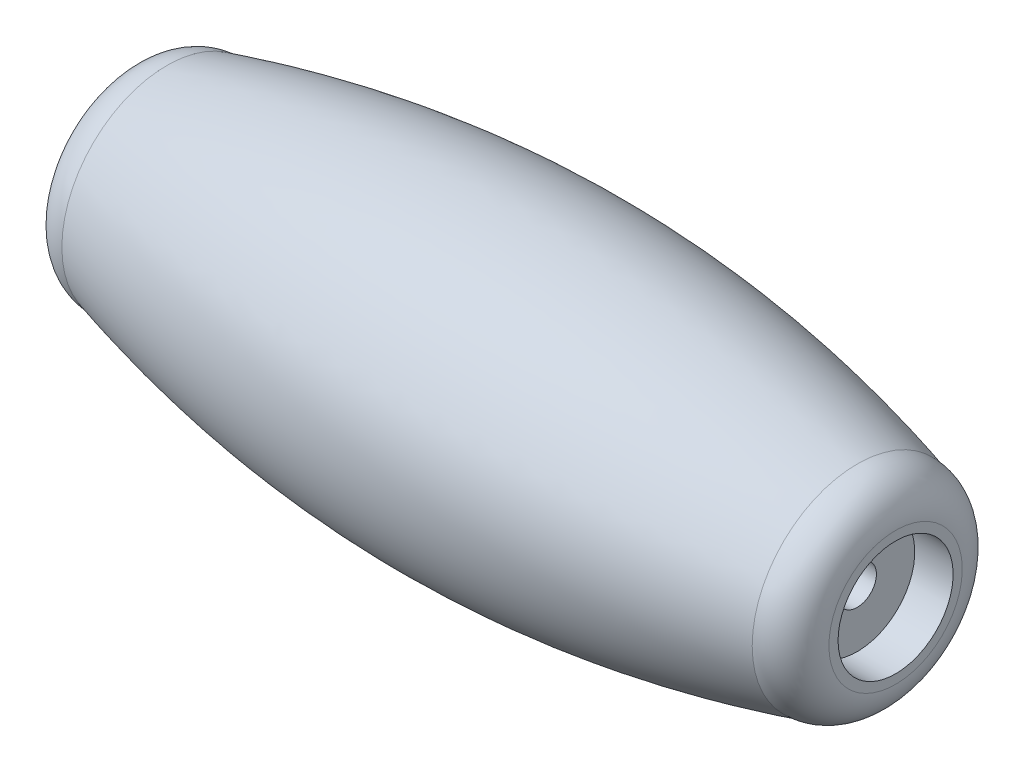
ISO-10303-21;
HEADER;
FILE_DESCRIPTION(('STEP AP214'),'2;1');
FILE_NAME('part.step','',(''),(''),'','','');
FILE_SCHEMA(('AUTOMOTIVE_DESIGN { 1 0 10303 214 1 1 1 1 }'));
ENDSEC;
DATA;
#1=APPLICATION_CONTEXT('core data for automotive mechanical design processes');
#2=APPLICATION_PROTOCOL_DEFINITION('international standard','automotive_design',2000,#1);
#3=PRODUCT_CONTEXT('',#1,'mechanical');
#4=PRODUCT('Part','Part','',(#3));
#5=PRODUCT_RELATED_PRODUCT_CATEGORY('part','',(#4));
#6=PRODUCT_DEFINITION_FORMATION('','',#4);
#7=PRODUCT_DEFINITION_CONTEXT('part definition',#1,'design');
#8=PRODUCT_DEFINITION('design','',#6,#7);
#9=PRODUCT_DEFINITION_SHAPE('','',#8);
#10=(LENGTH_UNIT() NAMED_UNIT(*) SI_UNIT(.MILLI.,.METRE.));
#11=(NAMED_UNIT(*) PLANE_ANGLE_UNIT() SI_UNIT($,.RADIAN.));
#12=(NAMED_UNIT(*) SI_UNIT($,.STERADIAN.) SOLID_ANGLE_UNIT());
#13=UNCERTAINTY_MEASURE_WITH_UNIT(LENGTH_MEASURE(1.E-05),#10,'distance_accuracy_value','');
#14=(GEOMETRIC_REPRESENTATION_CONTEXT(3) GLOBAL_UNCERTAINTY_ASSIGNED_CONTEXT((#13)) GLOBAL_UNIT_ASSIGNED_CONTEXT((#10,
#11,#12)) REPRESENTATION_CONTEXT('',''));
#15=CARTESIAN_POINT('',(0.,0.,0.));
#16=DIRECTION('',(0.,0.,1.));
#17=DIRECTION('',(1.,0.,0.));
#18=AXIS2_PLACEMENT_3D('',#15,#16,#17);
#19=CARTESIAN_POINT('',(15.,2.25,0.));
#20=DIRECTION('',(-1.,0.,0.));
#21=DIRECTION('',(0.,0.,1.));
#22=AXIS2_PLACEMENT_3D('',#19,#20,#21);
#23=PLANE('',#22);
#24=CARTESIAN_POINT('',(15.,0.,0.));
#25=DIRECTION('',(-1.,0.,0.));
#26=DIRECTION('',(0.,0.,1.));
#27=AXIS2_PLACEMENT_3D('',#24,#25,#26);
#28=CIRCLE('',#27,2.6083193093986);
#29=CARTESIAN_POINT('',(15.,0.,2.6083193093986));
#30=VERTEX_POINT('',#29);
#31=EDGE_CURVE('E68',#30,#30,#28,.T.);
#32=ORIENTED_EDGE('',*,*,#31,.F.);
#33=EDGE_LOOP('',(#32));
#34=FACE_BOUND('',#33,.T.);
#35=CARTESIAN_POINT('',(15.,0.,0.));
#36=DIRECTION('',(-1.,0.,0.));
#37=DIRECTION('',(0.,0.,1.));
#38=AXIS2_PLACEMENT_3D('',#35,#36,#37);
#39=CIRCLE('',#38,2.25);
#40=CARTESIAN_POINT('',(15.,0.,2.25));
#41=VERTEX_POINT('',#40);
#42=EDGE_CURVE('E10',#41,#41,#39,.T.);
#43=ORIENTED_EDGE('',*,*,#42,.T.);
#44=EDGE_LOOP('',(#43));
#45=FACE_BOUND('',#44,.T.);
#46=ADVANCED_FACE('F34',(#34,#45),#23,.F.);
#47=CARTESIAN_POINT('',(-15.,0.,0.));
#48=DIRECTION('',(-1.,0.,0.));
#49=DIRECTION('',(0.,0.,1.));
#50=AXIS2_PLACEMENT_3D('',#47,#48,#49);
#51=CYLINDRICAL_SURFACE('',#50,2.25);
#52=ORIENTED_EDGE('',*,*,#42,.F.);
#53=EDGE_LOOP('',(#52));
#54=FACE_BOUND('',#53,.T.);
#55=CARTESIAN_POINT('',(13.5,0.,0.));
#56=DIRECTION('',(-1.,0.,0.));
#57=DIRECTION('',(0.,0.,1.));
#58=AXIS2_PLACEMENT_3D('',#55,#56,#57);
#59=CIRCLE('',#58,2.25);
#60=CARTESIAN_POINT('',(13.5,0.,2.25));
#61=VERTEX_POINT('',#60);
#62=EDGE_CURVE('E40',#61,#61,#59,.T.);
#63=ORIENTED_EDGE('',*,*,#62,.T.);
#64=EDGE_LOOP('',(#63));
#65=FACE_BOUND('',#64,.T.);
#66=ADVANCED_FACE('F106',(#54,#65),#51,.F.);
#67=CARTESIAN_POINT('',(13.5,2.25,0.));
#68=DIRECTION('',(-1.,0.,0.));
#69=DIRECTION('',(0.,0.,1.));
#70=AXIS2_PLACEMENT_3D('',#67,#68,#69);
#71=PLANE('',#70);
#72=ORIENTED_EDGE('',*,*,#62,.F.);
#73=EDGE_LOOP('',(#72));
#74=FACE_BOUND('',#73,.T.);
#75=CARTESIAN_POINT('',(13.5,0.,0.));
#76=DIRECTION('',(-1.,0.,0.));
#77=DIRECTION('',(0.,0.,1.));
#78=AXIS2_PLACEMENT_3D('',#75,#76,#77);
#79=CIRCLE('',#78,0.75);
#80=CARTESIAN_POINT('',(13.5,0.,0.75));
#81=VERTEX_POINT('',#80);
#82=EDGE_CURVE('E44',#81,#81,#79,.T.);
#83=ORIENTED_EDGE('',*,*,#82,.T.);
#84=EDGE_LOOP('',(#83));
#85=FACE_BOUND('',#84,.T.);
#86=ADVANCED_FACE('F103',(#74,#85),#71,.F.);
#87=CARTESIAN_POINT('',(-15.,0.,0.));
#88=DIRECTION('',(-1.,0.,0.));
#89=DIRECTION('',(0.,0.,1.));
#90=AXIS2_PLACEMENT_3D('',#87,#88,#89);
#91=CYLINDRICAL_SURFACE('',#90,0.75);
#92=ORIENTED_EDGE('',*,*,#82,.F.);
#93=EDGE_LOOP('',(#92));
#94=FACE_BOUND('',#93,.T.);
#95=CARTESIAN_POINT('',(-13.5,0.,0.));
#96=DIRECTION('',(-1.,0.,0.));
#97=DIRECTION('',(0.,0.,1.));
#98=AXIS2_PLACEMENT_3D('',#95,#96,#97);
#99=CIRCLE('',#98,0.75);
#100=CARTESIAN_POINT('',(-13.5,0.,0.75));
#101=VERTEX_POINT('',#100);
#102=EDGE_CURVE('E48',#101,#101,#99,.T.);
#103=ORIENTED_EDGE('',*,*,#102,.T.);
#104=EDGE_LOOP('',(#103));
#105=FACE_BOUND('',#104,.T.);
#106=ADVANCED_FACE('F99',(#94,#105),#91,.F.);
#107=CARTESIAN_POINT('',(-13.5,2.25,0.));
#108=DIRECTION('',(1.,0.,0.));
#109=DIRECTION('',(0.,0.,-1.));
#110=AXIS2_PLACEMENT_3D('',#107,#108,#109);
#111=PLANE('',#110);
#112=ORIENTED_EDGE('',*,*,#102,.F.);
#113=EDGE_LOOP('',(#112));
#114=FACE_BOUND('',#113,.T.);
#115=CARTESIAN_POINT('',(-13.5,0.,0.));
#116=DIRECTION('',(-1.,0.,0.));
#117=DIRECTION('',(0.,0.,1.));
#118=AXIS2_PLACEMENT_3D('',#115,#116,#117);
#119=CIRCLE('',#118,2.25);
#120=CARTESIAN_POINT('',(-13.5,0.,2.25));
#121=VERTEX_POINT('',#120);
#122=EDGE_CURVE('E53',#121,#121,#119,.T.);
#123=ORIENTED_EDGE('',*,*,#122,.T.);
#124=EDGE_LOOP('',(#123));
#125=FACE_BOUND('',#124,.T.);
#126=ADVANCED_FACE('F95',(#114,#125),#111,.F.);
#127=CARTESIAN_POINT('',(-15.,0.,0.));
#128=DIRECTION('',(-1.,0.,0.));
#129=DIRECTION('',(0.,0.,1.));
#130=AXIS2_PLACEMENT_3D('',#127,#128,#129);
#131=CYLINDRICAL_SURFACE('',#130,2.25);
#132=ORIENTED_EDGE('',*,*,#122,.F.);
#133=EDGE_LOOP('',(#132));
#134=FACE_BOUND('',#133,.T.);
#135=CARTESIAN_POINT('',(-15.,0.,0.));
#136=DIRECTION('',(-1.,0.,0.));
#137=DIRECTION('',(0.,0.,1.));
#138=AXIS2_PLACEMENT_3D('',#135,#136,#137);
#139=CIRCLE('',#138,2.25);
#140=CARTESIAN_POINT('',(-15.,0.,2.25));
#141=VERTEX_POINT('',#140);
#142=EDGE_CURVE('E56',#141,#141,#139,.T.);
#143=ORIENTED_EDGE('',*,*,#142,.T.);
#144=EDGE_LOOP('',(#143));
#145=FACE_BOUND('',#144,.T.);
#146=ADVANCED_FACE('F91',(#134,#145),#131,.F.);
#147=CARTESIAN_POINT('',(-15.,2.25,0.));
#148=DIRECTION('',(1.,0.,0.));
#149=DIRECTION('',(0.,0.,-1.));
#150=AXIS2_PLACEMENT_3D('',#147,#148,#149);
#151=PLANE('',#150);
#152=ORIENTED_EDGE('',*,*,#142,.F.);
#153=EDGE_LOOP('',(#152));
#154=FACE_BOUND('',#153,.T.);
#155=CARTESIAN_POINT('',(-15.,0.,0.));
#156=DIRECTION('',(-1.,0.,0.));
#157=DIRECTION('',(0.,0.,1.));
#158=AXIS2_PLACEMENT_3D('',#155,#156,#157);
#159=CIRCLE('',#158,2.6083193093986);
#160=CARTESIAN_POINT('',(-15.,0.,2.6083193093986));
#161=VERTEX_POINT('',#160);
#162=EDGE_CURVE('E59',#161,#161,#159,.T.);
#163=ORIENTED_EDGE('',*,*,#162,.T.);
#164=EDGE_LOOP('',(#163));
#165=FACE_BOUND('',#164,.T.);
#166=ADVANCED_FACE('F87',(#154,#165),#151,.F.);
#167=CARTESIAN_POINT('',(-13.5,0.,0.));
#168=DIRECTION('',(-1.,0.,0.));
#169=DIRECTION('',(0.,0.,1.));
#170=AXIS2_PLACEMENT_3D('',#167,#168,#169);
#171=TOROIDAL_SURFACE('',#170,2.6083193093986,1.5);
#172=ORIENTED_EDGE('',*,*,#162,.F.);
#173=EDGE_LOOP('',(#172));
#174=FACE_BOUND('',#173,.T.);
#175=CARTESIAN_POINT('',(-13.5,0.,0.));
#176=DIRECTION('',(-1.,0.,0.));
#177=DIRECTION('',(0.,0.,1.));
#178=AXIS2_PLACEMENT_3D('',#175,#176,#177);
#179=CIRCLE('',#178,4.1083193093986);
#180=CARTESIAN_POINT('',(-13.5,0.,4.1083193093986));
#181=VERTEX_POINT('',#180);
#182=EDGE_CURVE('E62',#181,#181,#179,.T.);
#183=ORIENTED_EDGE('',*,*,#182,.T.);
#184=EDGE_LOOP('',(#183));
#185=FACE_BOUND('',#184,.T.);
#186=ADVANCED_FACE('F83',(#174,#185),#171,.T.);
#187=CARTESIAN_POINT('',(13.5,4.1083193093986,0.));
#188=CARTESIAN_POINT('',(0.,7.8916806906014,0.));
#189=CARTESIAN_POINT('',(-13.5,4.1083193093986,0.));
#190=B_SPLINE_CURVE_WITH_KNOTS('',2,(#187,#188,#189),.UNSPECIFIED.,.F.,.F.,(3,3),(0.,1.),.UNSPECIFIED.);
#191=CARTESIAN_POINT('',(-15.,0.,0.));
#192=DIRECTION('',(-1.,0.,0.));
#193=AXIS1_PLACEMENT('',#191,#192);
#194=SURFACE_OF_REVOLUTION('',#190,#193);
#195=ORIENTED_EDGE('',*,*,#182,.F.);
#196=EDGE_LOOP('',(#195));
#197=FACE_BOUND('',#196,.T.);
#198=CARTESIAN_POINT('',(13.5,0.,0.));
#199=DIRECTION('',(-1.,0.,0.));
#200=DIRECTION('',(0.,0.,1.));
#201=AXIS2_PLACEMENT_3D('',#198,#199,#200);
#202=CIRCLE('',#201,4.1083193093986);
#203=CARTESIAN_POINT('',(13.5,0.,4.1083193093986));
#204=VERTEX_POINT('',#203);
#205=EDGE_CURVE('E65',#204,#204,#202,.T.);
#206=ORIENTED_EDGE('',*,*,#205,.T.);
#207=EDGE_LOOP('',(#206));
#208=FACE_BOUND('',#207,.T.);
#209=ADVANCED_FACE('F78',(#197,#208),#194,.T.);
#210=CARTESIAN_POINT('',(13.5,0.,0.));
#211=DIRECTION('',(-1.,0.,0.));
#212=DIRECTION('',(0.,0.,1.));
#213=AXIS2_PLACEMENT_3D('',#210,#211,#212);
#214=TOROIDAL_SURFACE('',#213,2.6083193093986,1.5);
#215=ORIENTED_EDGE('',*,*,#205,.F.);
#216=EDGE_LOOP('',(#215));
#217=FACE_BOUND('',#216,.T.);
#218=ORIENTED_EDGE('',*,*,#31,.T.);
#219=EDGE_LOOP('',(#218));
#220=FACE_BOUND('',#219,.T.);
#221=ADVANCED_FACE('F82',(#217,#220),#214,.T.);
#222=CLOSED_SHELL('',(#46,#66,#86,#106,#126,#146,#166,#186,#209,#221));
#223=MANIFOLD_SOLID_BREP('B2',#222);
#224=ADVANCED_BREP_SHAPE_REPRESENTATION('',(#18,#223),#14);
#225=SHAPE_DEFINITION_REPRESENTATION(#9,#224);
ENDSEC;
END-ISO-10303-21;
